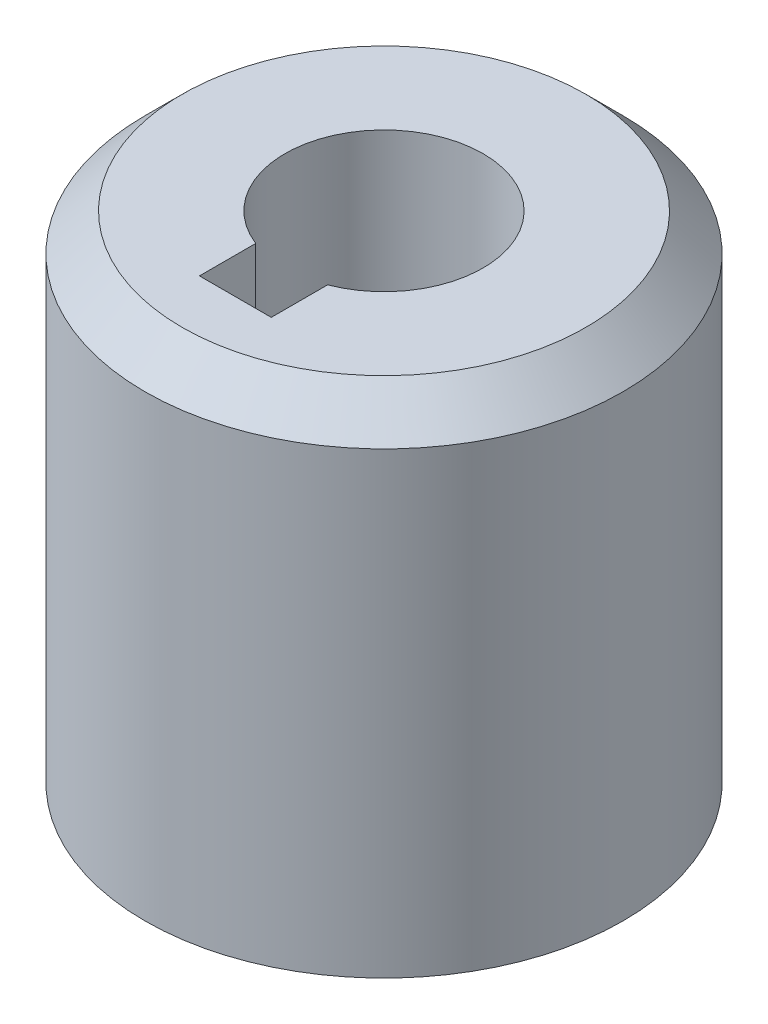
ISO-10303-21;
HEADER;
FILE_DESCRIPTION(('STEP AP214'),'2;1');
FILE_NAME('part.step','',(''),(''),'','','');
FILE_SCHEMA(('AUTOMOTIVE_DESIGN { 1 0 10303 214 1 1 1 1 }'));
ENDSEC;
DATA;
#1=APPLICATION_CONTEXT('core data for automotive mechanical design processes');
#2=APPLICATION_PROTOCOL_DEFINITION('international standard','automotive_design',2000,#1);
#3=PRODUCT_CONTEXT('',#1,'mechanical');
#4=PRODUCT('Part','Part','',(#3));
#5=PRODUCT_RELATED_PRODUCT_CATEGORY('part','',(#4));
#6=PRODUCT_DEFINITION_FORMATION('','',#4);
#7=PRODUCT_DEFINITION_CONTEXT('part definition',#1,'design');
#8=PRODUCT_DEFINITION('design','',#6,#7);
#9=PRODUCT_DEFINITION_SHAPE('','',#8);
#10=(LENGTH_UNIT() NAMED_UNIT(*) SI_UNIT(.MILLI.,.METRE.));
#11=(NAMED_UNIT(*) PLANE_ANGLE_UNIT() SI_UNIT($,.RADIAN.));
#12=(NAMED_UNIT(*) SI_UNIT($,.STERADIAN.) SOLID_ANGLE_UNIT());
#13=UNCERTAINTY_MEASURE_WITH_UNIT(LENGTH_MEASURE(1.E-05),#10,'distance_accuracy_value','');
#14=(GEOMETRIC_REPRESENTATION_CONTEXT(3) GLOBAL_UNCERTAINTY_ASSIGNED_CONTEXT((#13)) GLOBAL_UNIT_ASSIGNED_CONTEXT((#10,
#11,#12)) REPRESENTATION_CONTEXT('',''));
#15=CARTESIAN_POINT('',(0.,0.,0.));
#16=DIRECTION('',(0.,0.,1.));
#17=DIRECTION('',(1.,0.,0.));
#18=AXIS2_PLACEMENT_3D('',#15,#16,#17);
#19=CARTESIAN_POINT('',(0.,20.,0.));
#20=DIRECTION('',(0.,1.,0.));
#21=DIRECTION('',(0.,0.,1.));
#22=AXIS2_PLACEMENT_3D('',#19,#20,#21);
#23=PLANE('',#22);
#24=CARTESIAN_POINT('',(0.,20.,0.));
#25=DIRECTION('',(0.,1.,0.));
#26=DIRECTION('',(0.,0.,1.));
#27=AXIS2_PLACEMENT_3D('',#24,#25,#26);
#28=CIRCLE('',#27,8.15000000000001);
#29=CARTESIAN_POINT('',(0.,20.,8.15000000000001));
#30=VERTEX_POINT('',#29);
#31=EDGE_CURVE('E55',#30,#30,#28,.T.);
#32=ORIENTED_EDGE('',*,*,#31,.T.);
#33=EDGE_LOOP('',(#32));
#34=FACE_BOUND('',#33,.T.);
#35=DIRECTION('',(1.,0.,0.));
#36=VECTOR('',#35,1.);
#37=CARTESIAN_POINT('',(-1.45,20.,6.));
#38=LINE('',#37,#36);
#39=CARTESIAN_POINT('',(-1.45,20.,6.));
#40=VERTEX_POINT('',#39);
#41=CARTESIAN_POINT('',(1.45,20.,6.));
#42=VERTEX_POINT('',#41);
#43=EDGE_CURVE('E97',#40,#42,#38,.T.);
#44=ORIENTED_EDGE('',*,*,#43,.F.);
#45=DIRECTION('',(0.,0.,1.));
#46=VECTOR('',#45,1.);
#47=CARTESIAN_POINT('',(-1.45,20.,6.));
#48=LINE('',#47,#46);
#49=CARTESIAN_POINT('',(-1.45,20.,3.72793508527174));
#50=VERTEX_POINT('',#49);
#51=EDGE_CURVE('E88',#50,#40,#48,.T.);
#52=ORIENTED_EDGE('',*,*,#51,.F.);
#53=CARTESIAN_POINT('',(0.,20.,0.));
#54=DIRECTION('',(0.,1.,0.));
#55=DIRECTION('',(0.,0.,1.));
#56=AXIS2_PLACEMENT_3D('',#53,#54,#55);
#57=CIRCLE('',#56,4.);
#58=CARTESIAN_POINT('',(1.45,20.,3.72793508527174));
#59=VERTEX_POINT('',#58);
#60=EDGE_CURVE('E114',#59,#50,#57,.T.);
#61=ORIENTED_EDGE('',*,*,#60,.F.);
#62=DIRECTION('',(0.,0.,-1.));
#63=VECTOR('',#62,1.);
#64=CARTESIAN_POINT('',(1.45,20.,6.));
#65=LINE('',#64,#63);
#66=EDGE_CURVE('E110',#42,#59,#65,.T.);
#67=ORIENTED_EDGE('',*,*,#66,.F.);
#68=EDGE_LOOP('',(#44,#52,#61,#67));
#69=FACE_BOUND('',#68,.T.);
#70=ADVANCED_FACE('F45',(#34,#69),#23,.T.);
#71=CARTESIAN_POINT('',(0.,0.,0.));
#72=DIRECTION('',(0.,1.,0.));
#73=DIRECTION('',(0.,0.,1.));
#74=AXIS2_PLACEMENT_3D('',#71,#72,#73);
#75=PLANE('',#74);
#76=CARTESIAN_POINT('',(0.,0.,0.));
#77=DIRECTION('',(0.,1.,0.));
#78=DIRECTION('',(0.,0.,1.));
#79=AXIS2_PLACEMENT_3D('',#76,#77,#78);
#80=CIRCLE('',#79,9.65);
#81=CARTESIAN_POINT('',(0.,0.,9.65));
#82=VERTEX_POINT('',#81);
#83=EDGE_CURVE('E106',#82,#82,#80,.T.);
#84=ORIENTED_EDGE('',*,*,#83,.F.);
#85=EDGE_LOOP('',(#84));
#86=FACE_BOUND('',#85,.T.);
#87=DIRECTION('',(0.,0.,1.));
#88=VECTOR('',#87,1.);
#89=CARTESIAN_POINT('',(-1.45,0.,6.));
#90=LINE('',#89,#88);
#91=CARTESIAN_POINT('',(-1.45,0.,3.72793508527174));
#92=VERTEX_POINT('',#91);
#93=CARTESIAN_POINT('',(-1.45,0.,6.));
#94=VERTEX_POINT('',#93);
#95=EDGE_CURVE('E70',#92,#94,#90,.T.);
#96=ORIENTED_EDGE('',*,*,#95,.T.);
#97=DIRECTION('',(1.,0.,0.));
#98=VECTOR('',#97,1.);
#99=CARTESIAN_POINT('',(-1.45,0.,6.));
#100=LINE('',#99,#98);
#101=CARTESIAN_POINT('',(1.45,0.,6.));
#102=VERTEX_POINT('',#101);
#103=EDGE_CURVE('E104',#94,#102,#100,.T.);
#104=ORIENTED_EDGE('',*,*,#103,.T.);
#105=DIRECTION('',(0.,0.,-1.));
#106=VECTOR('',#105,1.);
#107=CARTESIAN_POINT('',(1.45,0.,6.));
#108=LINE('',#107,#106);
#109=CARTESIAN_POINT('',(1.45,0.,3.72793508527174));
#110=VERTEX_POINT('',#109);
#111=EDGE_CURVE('E123',#102,#110,#108,.T.);
#112=ORIENTED_EDGE('',*,*,#111,.T.);
#113=CARTESIAN_POINT('',(0.,0.,0.));
#114=DIRECTION('',(0.,1.,0.));
#115=DIRECTION('',(0.,0.,1.));
#116=AXIS2_PLACEMENT_3D('',#113,#114,#115);
#117=CIRCLE('',#116,4.);
#118=EDGE_CURVE('E98',#110,#92,#117,.T.);
#119=ORIENTED_EDGE('',*,*,#118,.T.);
#120=EDGE_LOOP('',(#96,#104,#112,#119));
#121=FACE_BOUND('',#120,.T.);
#122=ADVANCED_FACE('F153',(#86,#121),#75,.F.);
#123=CARTESIAN_POINT('',(0.,20.,0.));
#124=DIRECTION('',(0.,-1.,0.));
#125=DIRECTION('',(0.,0.,-1.));
#126=AXIS2_PLACEMENT_3D('',#123,#124,#125);
#127=CYLINDRICAL_SURFACE('',#126,9.65);
#128=CARTESIAN_POINT('',(0.,18.5,0.));
#129=DIRECTION('',(0.,1.,0.));
#130=DIRECTION('',(0.,0.,1.));
#131=AXIS2_PLACEMENT_3D('',#128,#129,#130);
#132=CIRCLE('',#131,9.65);
#133=CARTESIAN_POINT('',(0.,18.5,9.65));
#134=VERTEX_POINT('',#133);
#135=EDGE_CURVE('E11',#134,#134,#132,.F.);
#136=ORIENTED_EDGE('',*,*,#135,.T.);
#137=EDGE_LOOP('',(#136));
#138=FACE_BOUND('',#137,.T.);
#139=ORIENTED_EDGE('',*,*,#83,.T.);
#140=EDGE_LOOP('',(#139));
#141=FACE_BOUND('',#140,.T.);
#142=ADVANCED_FACE('F158',(#138,#141),#127,.T.);
#143=CARTESIAN_POINT('',(-1.45,20.,6.));
#144=DIRECTION('',(1.,0.,0.));
#145=DIRECTION('',(0.,0.,-1.));
#146=AXIS2_PLACEMENT_3D('',#143,#144,#145);
#147=PLANE('',#146);
#148=ORIENTED_EDGE('',*,*,#95,.F.);
#149=DIRECTION('',(0.,-1.,0.));
#150=VECTOR('',#149,1.);
#151=CARTESIAN_POINT('',(-1.45,20.,3.72793508527174));
#152=LINE('',#151,#150);
#153=EDGE_CURVE('E92',#50,#92,#152,.T.);
#154=ORIENTED_EDGE('',*,*,#153,.F.);
#155=ORIENTED_EDGE('',*,*,#51,.T.);
#156=DIRECTION('',(0.,-1.,0.));
#157=VECTOR('',#156,1.);
#158=CARTESIAN_POINT('',(-1.45,20.,6.));
#159=LINE('',#158,#157);
#160=EDGE_CURVE('E91',#40,#94,#159,.T.);
#161=ORIENTED_EDGE('',*,*,#160,.T.);
#162=EDGE_LOOP('',(#148,#154,#155,#161));
#163=FACE_BOUND('',#162,.T.);
#164=ADVANCED_FACE('F90',(#163),#147,.T.);
#165=CARTESIAN_POINT('',(-1.45,20.,6.));
#166=DIRECTION('',(0.,0.,-1.));
#167=DIRECTION('',(-1.,0.,0.));
#168=AXIS2_PLACEMENT_3D('',#165,#166,#167);
#169=PLANE('',#168);
#170=ORIENTED_EDGE('',*,*,#103,.F.);
#171=ORIENTED_EDGE('',*,*,#160,.F.);
#172=ORIENTED_EDGE('',*,*,#43,.T.);
#173=DIRECTION('',(0.,-1.,0.));
#174=VECTOR('',#173,1.);
#175=CARTESIAN_POINT('',(1.45,20.,6.));
#176=LINE('',#175,#174);
#177=EDGE_CURVE('E107',#42,#102,#176,.T.);
#178=ORIENTED_EDGE('',*,*,#177,.T.);
#179=EDGE_LOOP('',(#170,#171,#172,#178));
#180=FACE_BOUND('',#179,.T.);
#181=ADVANCED_FACE('F101',(#180),#169,.T.);
#182=CARTESIAN_POINT('',(1.45,20.,6.));
#183=DIRECTION('',(-1.,0.,0.));
#184=DIRECTION('',(0.,0.,1.));
#185=AXIS2_PLACEMENT_3D('',#182,#183,#184);
#186=PLANE('',#185);
#187=ORIENTED_EDGE('',*,*,#111,.F.);
#188=ORIENTED_EDGE('',*,*,#177,.F.);
#189=ORIENTED_EDGE('',*,*,#66,.T.);
#190=DIRECTION('',(0.,-1.,0.));
#191=VECTOR('',#190,1.);
#192=CARTESIAN_POINT('',(1.45,20.,3.72793508527174));
#193=LINE('',#192,#191);
#194=EDGE_CURVE('E62',#59,#110,#193,.T.);
#195=ORIENTED_EDGE('',*,*,#194,.T.);
#196=EDGE_LOOP('',(#187,#188,#189,#195));
#197=FACE_BOUND('',#196,.T.);
#198=ADVANCED_FACE('F149',(#197),#186,.T.);
#199=CARTESIAN_POINT('',(0.,20.,0.));
#200=DIRECTION('',(0.,-1.,0.));
#201=DIRECTION('',(0.,0.,-1.));
#202=AXIS2_PLACEMENT_3D('',#199,#200,#201);
#203=CYLINDRICAL_SURFACE('',#202,4.);
#204=ORIENTED_EDGE('',*,*,#118,.F.);
#205=ORIENTED_EDGE('',*,*,#194,.F.);
#206=ORIENTED_EDGE('',*,*,#60,.T.);
#207=ORIENTED_EDGE('',*,*,#153,.T.);
#208=EDGE_LOOP('',(#204,#205,#206,#207));
#209=FACE_BOUND('',#208,.T.);
#210=ADVANCED_FACE('F144',(#209),#203,.F.);
#211=CARTESIAN_POINT('',(0.,20.,0.));
#212=DIRECTION('',(0.,-1.,0.));
#213=DIRECTION('',(0.,0.,-1.));
#214=AXIS2_PLACEMENT_3D('',#211,#212,#213);
#215=CONICAL_SURFACE('',#214,8.15000000000001,0.785398163397444);
#216=ORIENTED_EDGE('',*,*,#135,.F.);
#217=EDGE_LOOP('',(#216));
#218=FACE_BOUND('',#217,.T.);
#219=ORIENTED_EDGE('',*,*,#31,.F.);
#220=EDGE_LOOP('',(#219));
#221=FACE_BOUND('',#220,.T.);
#222=ADVANCED_FACE('F48',(#218,#221),#215,.T.);
#223=CLOSED_SHELL('',(#70,#122,#142,#164,#181,#198,#210,#222));
#224=MANIFOLD_SOLID_BREP('B2',#223);
#225=ADVANCED_BREP_SHAPE_REPRESENTATION('',(#18,#224),#14);
#226=SHAPE_DEFINITION_REPRESENTATION(#9,#225);
ENDSEC;
END-ISO-10303-21;
